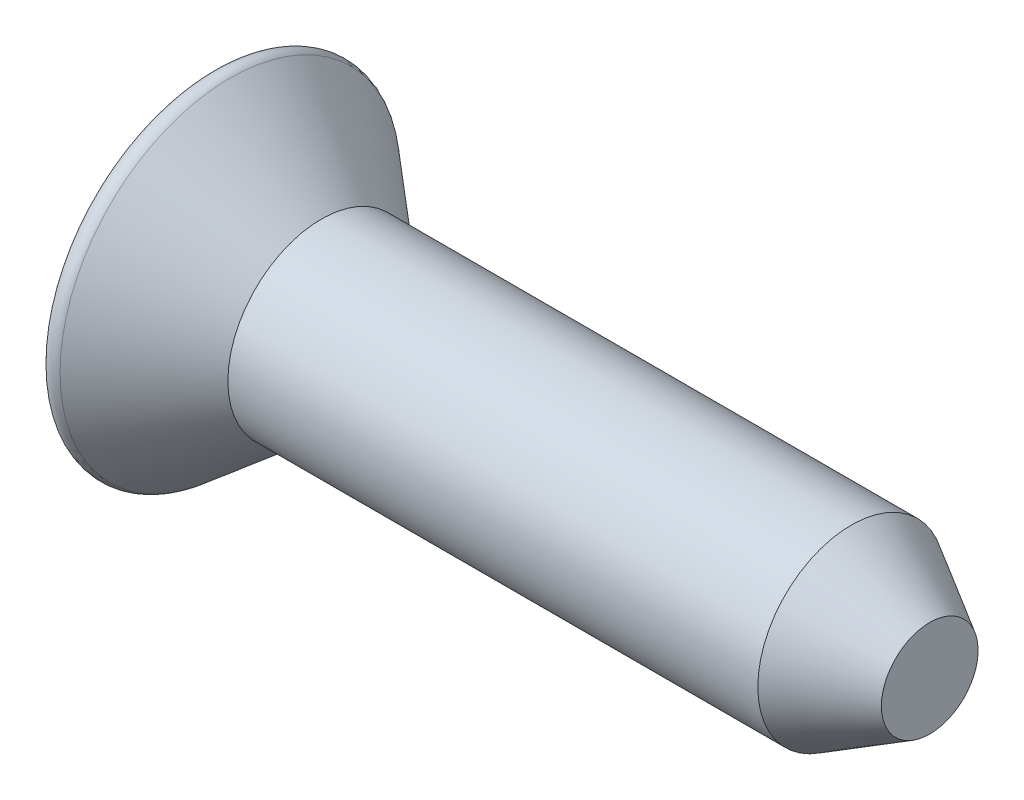
ISO-10303-21;
HEADER;
FILE_DESCRIPTION(('STEP AP214'),'2;1');
FILE_NAME('part.step','',(''),(''),'','','');
FILE_SCHEMA(('AUTOMOTIVE_DESIGN { 1 0 10303 214 1 1 1 1 }'));
ENDSEC;
DATA;
#1=APPLICATION_CONTEXT('core data for automotive mechanical design processes');
#2=APPLICATION_PROTOCOL_DEFINITION('international standard','automotive_design',2000,#1);
#3=PRODUCT_CONTEXT('',#1,'mechanical');
#4=PRODUCT('Part','Part','',(#3));
#5=PRODUCT_RELATED_PRODUCT_CATEGORY('part','',(#4));
#6=PRODUCT_DEFINITION_FORMATION('','',#4);
#7=PRODUCT_DEFINITION_CONTEXT('part definition',#1,'design');
#8=PRODUCT_DEFINITION('design','',#6,#7);
#9=PRODUCT_DEFINITION_SHAPE('','',#8);
#10=(LENGTH_UNIT() NAMED_UNIT(*) SI_UNIT(.MILLI.,.METRE.));
#11=(NAMED_UNIT(*) PLANE_ANGLE_UNIT() SI_UNIT($,.RADIAN.));
#12=(NAMED_UNIT(*) SI_UNIT($,.STERADIAN.) SOLID_ANGLE_UNIT());
#13=UNCERTAINTY_MEASURE_WITH_UNIT(LENGTH_MEASURE(1.E-05),#10,'distance_accuracy_value','');
#14=(GEOMETRIC_REPRESENTATION_CONTEXT(3) GLOBAL_UNCERTAINTY_ASSIGNED_CONTEXT((#13)) GLOBAL_UNIT_ASSIGNED_CONTEXT((#10,
#11,#12)) REPRESENTATION_CONTEXT('',''));
#15=CARTESIAN_POINT('',(0.,0.,0.));
#16=DIRECTION('',(0.,0.,1.));
#17=DIRECTION('',(1.,0.,0.));
#18=AXIS2_PLACEMENT_3D('',#15,#16,#17);
#19=CARTESIAN_POINT('',(0.,0.,0.));
#20=DIRECTION('',(-1.,0.,0.));
#21=DIRECTION('',(0.,0.,1.));
#22=AXIS2_PLACEMENT_3D('',#19,#20,#21);
#23=CYLINDRICAL_SURFACE('',#22,0.762);
#24=CARTESIAN_POINT('',(0.889,0.,0.));
#25=DIRECTION('',(-1.,0.,0.));
#26=DIRECTION('',(0.,0.,1.));
#27=AXIS2_PLACEMENT_3D('',#24,#25,#26);
#28=CIRCLE('',#27,0.762);
#29=CARTESIAN_POINT('',(0.889,0.,0.762));
#30=VERTEX_POINT('',#29);
#31=EDGE_CURVE('E226',#30,#30,#28,.T.);
#32=ORIENTED_EDGE('',*,*,#31,.F.);
#33=EDGE_LOOP('',(#32));
#34=FACE_BOUND('',#33,.T.);
#35=CARTESIAN_POINT('',(5.20408568757237,0.,0.));
#36=DIRECTION('',(-1.,0.,0.));
#37=DIRECTION('',(0.,0.,1.));
#38=AXIS2_PLACEMENT_3D('',#35,#36,#37);
#39=CIRCLE('',#38,0.762);
#40=CARTESIAN_POINT('',(5.20408568757237,0.,0.762));
#41=VERTEX_POINT('',#40);
#42=EDGE_CURVE('E445',#41,#41,#39,.T.);
#43=ORIENTED_EDGE('',*,*,#42,.T.);
#44=EDGE_LOOP('',(#43));
#45=FACE_BOUND('',#44,.T.);
#46=ADVANCED_FACE('F68',(#34,#45),#23,.T.);
#47=CARTESIAN_POINT('',(0.889,0.,0.));
#48=DIRECTION('',(-1.,0.,0.));
#49=DIRECTION('',(0.,0.,1.));
#50=AXIS2_PLACEMENT_3D('',#47,#48,#49);
#51=CONICAL_SURFACE('',#50,0.762,0.698131700797734);
#52=ORIENTED_EDGE('',*,*,#31,.T.);
#53=EDGE_LOOP('',(#52));
#54=FACE_BOUND('',#53,.T.);
#55=CARTESIAN_POINT('',(0.146043818501133,0.,0.));
#56=DIRECTION('',(-1.,0.,0.));
#57=DIRECTION('',(0.,0.,1.));
#58=AXIS2_PLACEMENT_3D('',#55,#56,#57);
#59=CIRCLE('',#58,1.38541425787658);
#60=CARTESIAN_POINT('',(0.146043818501133,0.,1.38541425787658));
#61=VERTEX_POINT('',#60);
#62=EDGE_CURVE('E229',#61,#61,#59,.T.);
#63=ORIENTED_EDGE('',*,*,#62,.F.);
#64=EDGE_LOOP('',(#63));
#65=FACE_BOUND('',#64,.T.);
#66=ADVANCED_FACE('F370',(#54,#65),#51,.T.);
#67=CARTESIAN_POINT('',(0.,0.1778,-0.7874));
#68=DIRECTION('',(-0.342020143325669,0.,0.939692620785908));
#69=DIRECTION('',(0.939692620785908,0.,0.342020143325669));
#70=AXIS2_PLACEMENT_3D('',#67,#68,#69);
#71=PLANE('',#70);
#72=DIRECTION('',(-0.939692620785908,0.,-0.342020143325669));
#73=VECTOR('',#72,1.);
#74=CARTESIAN_POINT('',(0.,-0.1778,-0.7874));
#75=LINE('',#74,#73);
#76=CARTESIAN_POINT('',(0.889,-0.1778,-0.463830461737345));
#77=VERTEX_POINT('',#76);
#78=CARTESIAN_POINT('',(0.,-0.1778,-0.7874));
#79=VERTEX_POINT('',#78);
#80=EDGE_CURVE('E236',#77,#79,#75,.T.);
#81=ORIENTED_EDGE('',*,*,#80,.F.);
#82=DIRECTION('',(0.,1.,0.));
#83=VECTOR('',#82,1.);
#84=CARTESIAN_POINT('',(0.889,0.1778,-0.463830461737345));
#85=LINE('',#84,#83);
#86=CARTESIAN_POINT('',(0.889,0.1778,-0.463830461737345));
#87=VERTEX_POINT('',#86);
#88=EDGE_CURVE('E42',#77,#87,#85,.T.);
#89=ORIENTED_EDGE('',*,*,#88,.T.);
#90=DIRECTION('',(-0.939692620785908,0.,-0.342020143325669));
#91=VECTOR('',#90,1.);
#92=CARTESIAN_POINT('',(0.785006754966385,0.1778,-0.501680907494333));
#93=LINE('',#92,#91);
#94=CARTESIAN_POINT('',(0.,0.1778,-0.7874));
#95=VERTEX_POINT('',#94);
#96=EDGE_CURVE('E240',#87,#95,#93,.T.);
#97=ORIENTED_EDGE('',*,*,#96,.T.);
#98=DIRECTION('',(0.,1.,0.));
#99=VECTOR('',#98,1.);
#100=CARTESIAN_POINT('',(0.,0.1778,-0.7874));
#101=LINE('',#100,#99);
#102=EDGE_CURVE('E219',#79,#95,#101,.T.);
#103=ORIENTED_EDGE('',*,*,#102,.F.);
#104=EDGE_LOOP('',(#81,#89,#97,#103));
#105=FACE_BOUND('',#104,.T.);
#106=ADVANCED_FACE('F348',(#105),#71,.T.);
#107=CARTESIAN_POINT('',(0.889,0.1778,-0.1778));
#108=DIRECTION('',(-1.,0.,0.));
#109=DIRECTION('',(0.,0.,1.));
#110=AXIS2_PLACEMENT_3D('',#107,#108,#109);
#111=PLANE('',#110);
#112=DIRECTION('',(0.,-0.707106781186547,-0.707106781186548));
#113=VECTOR('',#112,1.);
#114=CARTESIAN_POINT('',(0.889,-0.33528,0.1778));
#115=LINE('',#114,#113);
#116=CARTESIAN_POINT('',(0.889,-0.1778,0.33528));
#117=VERTEX_POINT('',#116);
#118=CARTESIAN_POINT('',(0.889,-0.33528,0.1778));
#119=VERTEX_POINT('',#118);
#120=EDGE_CURVE('E187',#117,#119,#115,.T.);
#121=ORIENTED_EDGE('',*,*,#120,.F.);
#122=DIRECTION('',(0.,0.,-1.));
#123=VECTOR('',#122,1.);
#124=CARTESIAN_POINT('',(0.889,-0.1778,0.1778));
#125=LINE('',#124,#123);
#126=CARTESIAN_POINT('',(0.889,-0.1778,0.463830461737345));
#127=VERTEX_POINT('',#126);
#128=EDGE_CURVE('E301',#127,#117,#125,.T.);
#129=ORIENTED_EDGE('',*,*,#128,.F.);
#130=DIRECTION('',(0.,-1.,0.));
#131=VECTOR('',#130,1.);
#132=CARTESIAN_POINT('',(0.889,0.1778,0.463830461737345));
#133=LINE('',#132,#131);
#134=CARTESIAN_POINT('',(0.889,0.1778,0.463830461737345));
#135=VERTEX_POINT('',#134);
#136=EDGE_CURVE('E255',#135,#127,#133,.T.);
#137=ORIENTED_EDGE('',*,*,#136,.F.);
#138=DIRECTION('',(0.,0.,1.));
#139=VECTOR('',#138,1.);
#140=CARTESIAN_POINT('',(0.889,0.1778,0.1778));
#141=LINE('',#140,#139);
#142=CARTESIAN_POINT('',(0.889,0.1778,0.33528));
#143=VERTEX_POINT('',#142);
#144=EDGE_CURVE('E272',#143,#135,#141,.T.);
#145=ORIENTED_EDGE('',*,*,#144,.F.);
#146=DIRECTION('',(0.,-0.707106781186548,0.707106781186548));
#147=VECTOR('',#146,1.);
#148=CARTESIAN_POINT('',(0.889,0.33528,0.1778));
#149=LINE('',#148,#147);
#150=CARTESIAN_POINT('',(0.889,0.33528,0.1778));
#151=VERTEX_POINT('',#150);
#152=EDGE_CURVE('E268',#151,#143,#149,.T.);
#153=ORIENTED_EDGE('',*,*,#152,.F.);
#154=DIRECTION('',(0.,-1.,0.));
#155=VECTOR('',#154,1.);
#156=CARTESIAN_POINT('',(0.889,0.7874,0.1778));
#157=LINE('',#156,#155);
#158=CARTESIAN_POINT('',(0.889,0.463830461737345,0.1778));
#159=VERTEX_POINT('',#158);
#160=EDGE_CURVE('E265',#159,#151,#157,.T.);
#161=ORIENTED_EDGE('',*,*,#160,.F.);
#162=DIRECTION('',(0.,0.,1.));
#163=VECTOR('',#162,1.);
#164=CARTESIAN_POINT('',(0.889,0.463830461737345,-0.1778));
#165=LINE('',#164,#163);
#166=CARTESIAN_POINT('',(0.889,0.463830461737345,-0.1778));
#167=VERTEX_POINT('',#166);
#168=EDGE_CURVE('E76',#167,#159,#165,.T.);
#169=ORIENTED_EDGE('',*,*,#168,.F.);
#170=DIRECTION('',(0.,1.,0.));
#171=VECTOR('',#170,1.);
#172=CARTESIAN_POINT('',(0.889,0.7874,-0.1778));
#173=LINE('',#172,#171);
#174=CARTESIAN_POINT('',(0.889,0.33528,-0.1778));
#175=VERTEX_POINT('',#174);
#176=EDGE_CURVE('E225',#175,#167,#173,.T.);
#177=ORIENTED_EDGE('',*,*,#176,.F.);
#178=DIRECTION('',(0.,0.707106781186548,0.707106781186548));
#179=VECTOR('',#178,1.);
#180=CARTESIAN_POINT('',(0.889,0.33528,-0.1778));
#181=LINE('',#180,#179);
#182=CARTESIAN_POINT('',(0.889,0.1778,-0.33528));
#183=VERTEX_POINT('',#182);
#184=EDGE_CURVE('E83',#183,#175,#181,.T.);
#185=ORIENTED_EDGE('',*,*,#184,.F.);
#186=DIRECTION('',(0.,0.,1.));
#187=VECTOR('',#186,1.);
#188=CARTESIAN_POINT('',(0.889,0.1778,-0.7874));
#189=LINE('',#188,#187);
#190=EDGE_CURVE('E242',#87,#183,#189,.T.);
#191=ORIENTED_EDGE('',*,*,#190,.F.);
#192=ORIENTED_EDGE('',*,*,#88,.F.);
#193=DIRECTION('',(0.,0.,-1.));
#194=VECTOR('',#193,1.);
#195=CARTESIAN_POINT('',(0.889,-0.1778,-0.7874));
#196=LINE('',#195,#194);
#197=CARTESIAN_POINT('',(0.889,-0.1778,-0.33528));
#198=VERTEX_POINT('',#197);
#199=EDGE_CURVE('E337',#198,#77,#196,.T.);
#200=ORIENTED_EDGE('',*,*,#199,.F.);
#201=DIRECTION('',(0.,0.707106781186547,-0.707106781186548));
#202=VECTOR('',#201,1.);
#203=CARTESIAN_POINT('',(0.889,-0.33528,-0.1778));
#204=LINE('',#203,#202);
#205=CARTESIAN_POINT('',(0.889,-0.33528,-0.1778));
#206=VERTEX_POINT('',#205);
#207=EDGE_CURVE('E307',#206,#198,#204,.T.);
#208=ORIENTED_EDGE('',*,*,#207,.F.);
#209=DIRECTION('',(0.,1.,0.));
#210=VECTOR('',#209,1.);
#211=CARTESIAN_POINT('',(0.889,-0.1778,-0.1778));
#212=LINE('',#211,#210);
#213=CARTESIAN_POINT('',(0.889,-0.463830461737345,-0.1778));
#214=VERTEX_POINT('',#213);
#215=EDGE_CURVE('E334',#214,#206,#212,.T.);
#216=ORIENTED_EDGE('',*,*,#215,.F.);
#217=DIRECTION('',(0.,0.,-1.));
#218=VECTOR('',#217,1.);
#219=CARTESIAN_POINT('',(0.889,-0.463830461737345,-0.1778));
#220=LINE('',#219,#218);
#221=CARTESIAN_POINT('',(0.889,-0.463830461737345,0.1778));
#222=VERTEX_POINT('',#221);
#223=EDGE_CURVE('E91',#222,#214,#220,.T.);
#224=ORIENTED_EDGE('',*,*,#223,.F.);
#225=DIRECTION('',(0.,-1.,0.));
#226=VECTOR('',#225,1.);
#227=CARTESIAN_POINT('',(0.889,-0.1778,0.1778));
#228=LINE('',#227,#226);
#229=EDGE_CURVE('E332',#119,#222,#228,.T.);
#230=ORIENTED_EDGE('',*,*,#229,.F.);
#231=EDGE_LOOP('',(#121,#129,#137,#145,#153,#161,#169,#177,#185,#191,#192,#200,#208,#216,#224,#230));
#232=FACE_BOUND('',#231,.T.);
#233=ADVANCED_FACE('F266',(#232),#111,.T.);
#234=CARTESIAN_POINT('',(0.,0.7874,-0.1778));
#235=DIRECTION('',(-0.342020143325669,-0.939692620785908,0.));
#236=DIRECTION('',(0.939692620785908,-0.342020143325669,0.));
#237=AXIS2_PLACEMENT_3D('',#234,#235,#236);
#238=PLANE('',#237);
#239=DIRECTION('',(-0.939692620785908,0.342020143325669,0.));
#240=VECTOR('',#239,1.);
#241=CARTESIAN_POINT('',(0.,0.7874,-0.1778));
#242=LINE('',#241,#240);
#243=CARTESIAN_POINT('',(0.,0.7874,-0.1778));
#244=VERTEX_POINT('',#243);
#245=EDGE_CURVE('E230',#167,#244,#242,.T.);
#246=ORIENTED_EDGE('',*,*,#245,.F.);
#247=ORIENTED_EDGE('',*,*,#168,.T.);
#248=DIRECTION('',(-0.939692620785908,0.342020143325669,0.));
#249=VECTOR('',#248,1.);
#250=CARTESIAN_POINT('',(0.785006754966385,0.501680907494333,0.1778));
#251=LINE('',#250,#249);
#252=CARTESIAN_POINT('',(0.,0.7874,0.1778));
#253=VERTEX_POINT('',#252);
#254=EDGE_CURVE('E245',#159,#253,#251,.T.);
#255=ORIENTED_EDGE('',*,*,#254,.T.);
#256=DIRECTION('',(0.,0.,1.));
#257=VECTOR('',#256,1.);
#258=CARTESIAN_POINT('',(0.,0.7874,-0.1778));
#259=LINE('',#258,#257);
#260=EDGE_CURVE('E281',#244,#253,#259,.T.);
#261=ORIENTED_EDGE('',*,*,#260,.F.);
#262=EDGE_LOOP('',(#246,#247,#255,#261));
#263=FACE_BOUND('',#262,.T.);
#264=ADVANCED_FACE('F260',(#263),#238,.T.);
#265=CARTESIAN_POINT('',(0.,0.1778,0.7874));
#266=DIRECTION('',(-0.342020143325669,0.,-0.939692620785908));
#267=DIRECTION('',(-0.939692620785908,0.,0.342020143325669));
#268=AXIS2_PLACEMENT_3D('',#265,#266,#267);
#269=PLANE('',#268);
#270=DIRECTION('',(-0.939692620785908,0.,0.342020143325669));
#271=VECTOR('',#270,1.);
#272=CARTESIAN_POINT('',(0.,0.1778,0.7874));
#273=LINE('',#272,#271);
#274=CARTESIAN_POINT('',(0.,0.1778,0.7874));
#275=VERTEX_POINT('',#274);
#276=EDGE_CURVE('E247',#135,#275,#273,.T.);
#277=ORIENTED_EDGE('',*,*,#276,.F.);
#278=ORIENTED_EDGE('',*,*,#136,.T.);
#279=DIRECTION('',(-0.939692620785908,0.,0.342020143325669));
#280=VECTOR('',#279,1.);
#281=CARTESIAN_POINT('',(0.980928418398843,-0.1778,0.430371253756997));
#282=LINE('',#281,#280);
#283=CARTESIAN_POINT('',(0.,-0.1778,0.7874));
#284=VERTEX_POINT('',#283);
#285=EDGE_CURVE('E250',#127,#284,#282,.T.);
#286=ORIENTED_EDGE('',*,*,#285,.T.);
#287=DIRECTION('',(0.,-1.,0.));
#288=VECTOR('',#287,1.);
#289=CARTESIAN_POINT('',(0.,0.1778,0.7874));
#290=LINE('',#289,#288);
#291=EDGE_CURVE('E211',#275,#284,#290,.T.);
#292=ORIENTED_EDGE('',*,*,#291,.F.);
#293=EDGE_LOOP('',(#277,#278,#286,#292));
#294=FACE_BOUND('',#293,.T.);
#295=ADVANCED_FACE('F294',(#294),#269,.T.);
#296=CARTESIAN_POINT('',(0.,-0.7874,-0.1778));
#297=DIRECTION('',(-0.342020143325669,0.939692620785908,0.));
#298=DIRECTION('',(-0.939692620785908,-0.342020143325669,0.));
#299=AXIS2_PLACEMENT_3D('',#296,#297,#298);
#300=PLANE('',#299);
#301=DIRECTION('',(-0.939692620785908,-0.342020143325669,0.));
#302=VECTOR('',#301,1.);
#303=CARTESIAN_POINT('',(0.,-0.7874,0.1778));
#304=LINE('',#303,#302);
#305=CARTESIAN_POINT('',(0.,-0.7874,0.1778));
#306=VERTEX_POINT('',#305);
#307=EDGE_CURVE('E205',#222,#306,#304,.T.);
#308=ORIENTED_EDGE('',*,*,#307,.F.);
#309=ORIENTED_EDGE('',*,*,#223,.T.);
#310=DIRECTION('',(-0.939692620785908,-0.342020143325669,0.));
#311=VECTOR('',#310,1.);
#312=CARTESIAN_POINT('',(0.980928418398843,-0.430371253756997,-0.1778));
#313=LINE('',#312,#311);
#314=CARTESIAN_POINT('',(0.,-0.7874,-0.1778));
#315=VERTEX_POINT('',#314);
#316=EDGE_CURVE('E239',#214,#315,#313,.T.);
#317=ORIENTED_EDGE('',*,*,#316,.T.);
#318=DIRECTION('',(0.,0.,-1.));
#319=VECTOR('',#318,1.);
#320=CARTESIAN_POINT('',(0.,-0.7874,-0.1778));
#321=LINE('',#320,#319);
#322=EDGE_CURVE('E207',#306,#315,#321,.T.);
#323=ORIENTED_EDGE('',*,*,#322,.F.);
#324=EDGE_LOOP('',(#308,#309,#317,#323));
#325=FACE_BOUND('',#324,.T.);
#326=ADVANCED_FACE('F70',(#325),#300,.T.);
#327=CARTESIAN_POINT('',(0.,0.,0.));
#328=DIRECTION('',(1.,0.,0.));
#329=DIRECTION('',(0.,0.,-1.));
#330=AXIS2_PLACEMENT_3D('',#327,#328,#329);
#331=PLANE('',#330);
#332=CARTESIAN_POINT('',(0.,0.,0.));
#333=DIRECTION('',(-1.,0.,0.));
#334=DIRECTION('',(0.,0.,1.));
#335=AXIS2_PLACEMENT_3D('',#332,#333,#334);
#336=CIRCLE('',#335,1.3173129068833);
#337=CARTESIAN_POINT('',(0.,0.,1.3173129068833));
#338=VERTEX_POINT('',#337);
#339=EDGE_CURVE('E233',#338,#338,#336,.T.);
#340=ORIENTED_EDGE('',*,*,#339,.T.);
#341=EDGE_LOOP('',(#340));
#342=FACE_BOUND('',#341,.T.);
#343=DIRECTION('',(0.,0.,-1.));
#344=VECTOR('',#343,1.);
#345=CARTESIAN_POINT('',(0.,-0.1778,0.1778));
#346=LINE('',#345,#344);
#347=CARTESIAN_POINT('',(0.,-0.1778,0.33528));
#348=VERTEX_POINT('',#347);
#349=EDGE_CURVE('E201',#284,#348,#346,.T.);
#350=ORIENTED_EDGE('',*,*,#349,.T.);
#351=DIRECTION('',(0.,0.707106781186547,0.707106781186548));
#352=VECTOR('',#351,1.);
#353=CARTESIAN_POINT('',(0.,-0.33528,0.1778));
#354=LINE('',#353,#352);
#355=CARTESIAN_POINT('',(0.,-0.33528,0.1778));
#356=VERTEX_POINT('',#355);
#357=EDGE_CURVE('E184',#356,#348,#354,.T.);
#358=ORIENTED_EDGE('',*,*,#357,.F.);
#359=DIRECTION('',(0.,-1.,0.));
#360=VECTOR('',#359,1.);
#361=CARTESIAN_POINT('',(0.,-0.1778,0.1778));
#362=LINE('',#361,#360);
#363=EDGE_CURVE('E197',#356,#306,#362,.T.);
#364=ORIENTED_EDGE('',*,*,#363,.T.);
#365=ORIENTED_EDGE('',*,*,#322,.T.);
#366=DIRECTION('',(0.,1.,0.));
#367=VECTOR('',#366,1.);
#368=CARTESIAN_POINT('',(0.,-0.1778,-0.1778));
#369=LINE('',#368,#367);
#370=CARTESIAN_POINT('',(0.,-0.33528,-0.1778));
#371=VERTEX_POINT('',#370);
#372=EDGE_CURVE('E209',#315,#371,#369,.T.);
#373=ORIENTED_EDGE('',*,*,#372,.T.);
#374=DIRECTION('',(0.,-0.707106781186547,0.707106781186548));
#375=VECTOR('',#374,1.);
#376=CARTESIAN_POINT('',(0.,-0.33528,-0.1778));
#377=LINE('',#376,#375);
#378=CARTESIAN_POINT('',(0.,-0.1778,-0.33528));
#379=VERTEX_POINT('',#378);
#380=EDGE_CURVE('E303',#379,#371,#377,.T.);
#381=ORIENTED_EDGE('',*,*,#380,.F.);
#382=DIRECTION('',(0.,0.,-1.));
#383=VECTOR('',#382,1.);
#384=CARTESIAN_POINT('',(0.,-0.1778,-0.7874));
#385=LINE('',#384,#383);
#386=EDGE_CURVE('E217',#379,#79,#385,.T.);
#387=ORIENTED_EDGE('',*,*,#386,.T.);
#388=ORIENTED_EDGE('',*,*,#102,.T.);
#389=DIRECTION('',(0.,0.,1.));
#390=VECTOR('',#389,1.);
#391=CARTESIAN_POINT('',(0.,0.1778,-0.7874));
#392=LINE('',#391,#390);
#393=CARTESIAN_POINT('',(0.,0.1778,-0.33528));
#394=VERTEX_POINT('',#393);
#395=EDGE_CURVE('E222',#95,#394,#392,.T.);
#396=ORIENTED_EDGE('',*,*,#395,.T.);
#397=DIRECTION('',(0.,-0.707106781186547,-0.707106781186547));
#398=VECTOR('',#397,1.);
#399=CARTESIAN_POINT('',(0.,0.33528,-0.1778));
#400=LINE('',#399,#398);
#401=CARTESIAN_POINT('',(0.,0.33528,-0.1778));
#402=VERTEX_POINT('',#401);
#403=EDGE_CURVE('E309',#402,#394,#400,.T.);
#404=ORIENTED_EDGE('',*,*,#403,.F.);
#405=DIRECTION('',(0.,1.,0.));
#406=VECTOR('',#405,1.);
#407=CARTESIAN_POINT('',(0.,0.7874,-0.1778));
#408=LINE('',#407,#406);
#409=EDGE_CURVE('E285',#402,#244,#408,.T.);
#410=ORIENTED_EDGE('',*,*,#409,.T.);
#411=ORIENTED_EDGE('',*,*,#260,.T.);
#412=DIRECTION('',(0.,-1.,0.));
#413=VECTOR('',#412,1.);
#414=CARTESIAN_POINT('',(0.,0.7874,0.1778));
#415=LINE('',#414,#413);
#416=CARTESIAN_POINT('',(0.,0.33528,0.1778));
#417=VERTEX_POINT('',#416);
#418=EDGE_CURVE('E276',#253,#417,#415,.T.);
#419=ORIENTED_EDGE('',*,*,#418,.T.);
#420=DIRECTION('',(0.,0.707106781186547,-0.707106781186547));
#421=VECTOR('',#420,1.);
#422=CARTESIAN_POINT('',(0.,0.33528,0.1778));
#423=LINE('',#422,#421);
#424=CARTESIAN_POINT('',(0.,0.1778,0.33528));
#425=VERTEX_POINT('',#424);
#426=EDGE_CURVE('E323',#425,#417,#423,.T.);
#427=ORIENTED_EDGE('',*,*,#426,.F.);
#428=DIRECTION('',(0.,0.,1.));
#429=VECTOR('',#428,1.);
#430=CARTESIAN_POINT('',(0.,0.1778,0.1778));
#431=LINE('',#430,#429);
#432=EDGE_CURVE('E280',#425,#275,#431,.T.);
#433=ORIENTED_EDGE('',*,*,#432,.T.);
#434=ORIENTED_EDGE('',*,*,#291,.T.);
#435=EDGE_LOOP('',(#350,#358,#364,#365,#373,#381,#387,#388,#396,#404,#410,#411,#419,#427,#433,#434));
#436=FACE_BOUND('',#435,.T.);
#437=ADVANCED_FACE('F195',(#342,#436),#331,.F.);
#438=CARTESIAN_POINT('',(0.0889,0.,0.));
#439=DIRECTION('',(-1.,0.,0.));
#440=DIRECTION('',(0.,0.,1.));
#441=AXIS2_PLACEMENT_3D('',#438,#439,#440);
#442=TOROIDAL_SURFACE('',#441,1.3173129068833,0.0889000000000001);
#443=ORIENTED_EDGE('',*,*,#339,.F.);
#444=EDGE_LOOP('',(#443));
#445=FACE_BOUND('',#444,.T.);
#446=ORIENTED_EDGE('',*,*,#62,.T.);
#447=EDGE_LOOP('',(#446));
#448=FACE_BOUND('',#447,.T.);
#449=ADVANCED_FACE('F366',(#445,#448),#442,.T.);
#450=CARTESIAN_POINT('',(0.889,0.7874,-0.1778));
#451=DIRECTION('',(0.,0.,1.));
#452=DIRECTION('',(0.,-1.,0.));
#453=AXIS2_PLACEMENT_3D('',#450,#451,#452);
#454=PLANE('',#453);
#455=DIRECTION('',(-1.,0.,0.));
#456=VECTOR('',#455,1.);
#457=CARTESIAN_POINT('',(1.11171035180252,0.33528,-0.1778));
#458=LINE('',#457,#456);
#459=EDGE_CURVE('E317',#175,#402,#458,.T.);
#460=ORIENTED_EDGE('',*,*,#459,.F.);
#461=ORIENTED_EDGE('',*,*,#176,.T.);
#462=ORIENTED_EDGE('',*,*,#245,.T.);
#463=ORIENTED_EDGE('',*,*,#409,.F.);
#464=EDGE_LOOP('',(#460,#461,#462,#463));
#465=FACE_BOUND('',#464,.T.);
#466=ADVANCED_FACE('F385',(#465),#454,.T.);
#467=CARTESIAN_POINT('',(0.889,0.7874,0.1778));
#468=DIRECTION('',(0.,0.,-1.));
#469=DIRECTION('',(-1.,0.,0.));
#470=AXIS2_PLACEMENT_3D('',#467,#468,#469);
#471=PLANE('',#470);
#472=DIRECTION('',(-1.,0.,0.));
#473=VECTOR('',#472,1.);
#474=CARTESIAN_POINT('',(1.11171035180252,0.33528,0.1778));
#475=LINE('',#474,#473);
#476=EDGE_CURVE('E278',#151,#417,#475,.T.);
#477=ORIENTED_EDGE('',*,*,#476,.T.);
#478=ORIENTED_EDGE('',*,*,#418,.F.);
#479=ORIENTED_EDGE('',*,*,#254,.F.);
#480=ORIENTED_EDGE('',*,*,#160,.T.);
#481=EDGE_LOOP('',(#477,#478,#479,#480));
#482=FACE_BOUND('',#481,.T.);
#483=ADVANCED_FACE('F274',(#482),#471,.T.);
#484=CARTESIAN_POINT('',(0.889,0.1778,0.1778));
#485=DIRECTION('',(0.,-1.,0.));
#486=DIRECTION('',(0.,0.,-1.));
#487=AXIS2_PLACEMENT_3D('',#484,#485,#486);
#488=PLANE('',#487);
#489=DIRECTION('',(-1.,0.,0.));
#490=VECTOR('',#489,1.);
#491=CARTESIAN_POINT('',(1.11171035180252,0.1778,0.33528));
#492=LINE('',#491,#490);
#493=EDGE_CURVE('E326',#143,#425,#492,.T.);
#494=ORIENTED_EDGE('',*,*,#493,.F.);
#495=ORIENTED_EDGE('',*,*,#144,.T.);
#496=ORIENTED_EDGE('',*,*,#276,.T.);
#497=ORIENTED_EDGE('',*,*,#432,.F.);
#498=EDGE_LOOP('',(#494,#495,#496,#497));
#499=FACE_BOUND('',#498,.T.);
#500=ADVANCED_FACE('F411',(#499),#488,.T.);
#501=CARTESIAN_POINT('',(0.889,-0.1778,0.1778));
#502=DIRECTION('',(0.,1.,0.));
#503=DIRECTION('',(0.,0.,1.));
#504=AXIS2_PLACEMENT_3D('',#501,#502,#503);
#505=PLANE('',#504);
#506=DIRECTION('',(-1.,0.,0.));
#507=VECTOR('',#506,1.);
#508=CARTESIAN_POINT('',(1.11171035180252,-0.1778,0.33528));
#509=LINE('',#508,#507);
#510=EDGE_CURVE('E191',#117,#348,#509,.T.);
#511=ORIENTED_EDGE('',*,*,#510,.T.);
#512=ORIENTED_EDGE('',*,*,#349,.F.);
#513=ORIENTED_EDGE('',*,*,#285,.F.);
#514=ORIENTED_EDGE('',*,*,#128,.T.);
#515=EDGE_LOOP('',(#511,#512,#513,#514));
#516=FACE_BOUND('',#515,.T.);
#517=ADVANCED_FACE('F300',(#516),#505,.T.);
#518=CARTESIAN_POINT('',(0.889,-0.1778,0.1778));
#519=DIRECTION('',(0.,0.,-1.));
#520=DIRECTION('',(0.,1.,0.));
#521=AXIS2_PLACEMENT_3D('',#518,#519,#520);
#522=PLANE('',#521);
#523=DIRECTION('',(-1.,0.,0.));
#524=VECTOR('',#523,1.);
#525=CARTESIAN_POINT('',(1.11171035180252,-0.33528,0.1778));
#526=LINE('',#525,#524);
#527=EDGE_CURVE('E181',#119,#356,#526,.T.);
#528=ORIENTED_EDGE('',*,*,#527,.F.);
#529=ORIENTED_EDGE('',*,*,#229,.T.);
#530=ORIENTED_EDGE('',*,*,#307,.T.);
#531=ORIENTED_EDGE('',*,*,#363,.F.);
#532=EDGE_LOOP('',(#528,#529,#530,#531));
#533=FACE_BOUND('',#532,.T.);
#534=ADVANCED_FACE('F204',(#533),#522,.T.);
#535=CARTESIAN_POINT('',(0.889,-0.1778,-0.1778));
#536=DIRECTION('',(0.,0.,1.));
#537=DIRECTION('',(0.,-1.,0.));
#538=AXIS2_PLACEMENT_3D('',#535,#536,#537);
#539=PLANE('',#538);
#540=DIRECTION('',(-1.,0.,0.));
#541=VECTOR('',#540,1.);
#542=CARTESIAN_POINT('',(1.11171035180252,-0.33528,-0.1778));
#543=LINE('',#542,#541);
#544=EDGE_CURVE('E310',#206,#371,#543,.T.);
#545=ORIENTED_EDGE('',*,*,#544,.T.);
#546=ORIENTED_EDGE('',*,*,#372,.F.);
#547=ORIENTED_EDGE('',*,*,#316,.F.);
#548=ORIENTED_EDGE('',*,*,#215,.T.);
#549=EDGE_LOOP('',(#545,#546,#547,#548));
#550=FACE_BOUND('',#549,.T.);
#551=ADVANCED_FACE('F360',(#550),#539,.T.);
#552=CARTESIAN_POINT('',(0.889,-0.1778,-0.7874));
#553=DIRECTION('',(0.,1.,0.));
#554=DIRECTION('',(0.,0.,1.));
#555=AXIS2_PLACEMENT_3D('',#552,#553,#554);
#556=PLANE('',#555);
#557=DIRECTION('',(-1.,0.,0.));
#558=VECTOR('',#557,1.);
#559=CARTESIAN_POINT('',(1.11171035180252,-0.1778,-0.33528));
#560=LINE('',#559,#558);
#561=EDGE_CURVE('E312',#198,#379,#560,.T.);
#562=ORIENTED_EDGE('',*,*,#561,.F.);
#563=ORIENTED_EDGE('',*,*,#199,.T.);
#564=ORIENTED_EDGE('',*,*,#80,.T.);
#565=ORIENTED_EDGE('',*,*,#386,.F.);
#566=EDGE_LOOP('',(#562,#563,#564,#565));
#567=FACE_BOUND('',#566,.T.);
#568=ADVANCED_FACE('F352',(#567),#556,.T.);
#569=CARTESIAN_POINT('',(0.889,0.1778,-0.7874));
#570=DIRECTION('',(0.,-1.,0.));
#571=DIRECTION('',(0.,0.,-1.));
#572=AXIS2_PLACEMENT_3D('',#569,#570,#571);
#573=PLANE('',#572);
#574=DIRECTION('',(-1.,0.,0.));
#575=VECTOR('',#574,1.);
#576=CARTESIAN_POINT('',(1.11171035180252,0.1778,-0.33528));
#577=LINE('',#576,#575);
#578=EDGE_CURVE('E318',#183,#394,#577,.T.);
#579=ORIENTED_EDGE('',*,*,#578,.T.);
#580=ORIENTED_EDGE('',*,*,#395,.F.);
#581=ORIENTED_EDGE('',*,*,#96,.F.);
#582=ORIENTED_EDGE('',*,*,#190,.T.);
#583=EDGE_LOOP('',(#579,#580,#581,#582));
#584=FACE_BOUND('',#583,.T.);
#585=ADVANCED_FACE('F341',(#584),#573,.T.);
#586=CARTESIAN_POINT('',(1.11171035180252,0.33528,0.1778));
#587=DIRECTION('',(0.,0.707106781186548,0.707106781186548));
#588=DIRECTION('',(0.,-0.707106781186548,0.707106781186548));
#589=AXIS2_PLACEMENT_3D('',#586,#587,#588);
#590=PLANE('',#589);
#591=ORIENTED_EDGE('',*,*,#152,.T.);
#592=ORIENTED_EDGE('',*,*,#493,.T.);
#593=ORIENTED_EDGE('',*,*,#426,.T.);
#594=ORIENTED_EDGE('',*,*,#476,.F.);
#595=EDGE_LOOP('',(#591,#592,#593,#594));
#596=FACE_BOUND('',#595,.T.);
#597=ADVANCED_FACE('F399',(#596),#590,.F.);
#598=CARTESIAN_POINT('',(1.11171035180252,0.33528,-0.1778));
#599=DIRECTION('',(0.,0.707106781186548,-0.707106781186548));
#600=DIRECTION('',(0.,0.707106781186548,0.707106781186548));
#601=AXIS2_PLACEMENT_3D('',#598,#599,#600);
#602=PLANE('',#601);
#603=ORIENTED_EDGE('',*,*,#184,.T.);
#604=ORIENTED_EDGE('',*,*,#459,.T.);
#605=ORIENTED_EDGE('',*,*,#403,.T.);
#606=ORIENTED_EDGE('',*,*,#578,.F.);
#607=EDGE_LOOP('',(#603,#604,#605,#606));
#608=FACE_BOUND('',#607,.T.);
#609=ADVANCED_FACE('F422',(#608),#602,.F.);
#610=CARTESIAN_POINT('',(1.11171035180252,-0.33528,-0.1778));
#611=DIRECTION('',(0.,-0.707106781186548,-0.707106781186547));
#612=DIRECTION('',(0.,0.707106781186547,-0.707106781186548));
#613=AXIS2_PLACEMENT_3D('',#610,#611,#612);
#614=PLANE('',#613);
#615=ORIENTED_EDGE('',*,*,#207,.T.);
#616=ORIENTED_EDGE('',*,*,#561,.T.);
#617=ORIENTED_EDGE('',*,*,#380,.T.);
#618=ORIENTED_EDGE('',*,*,#544,.F.);
#619=EDGE_LOOP('',(#615,#616,#617,#618));
#620=FACE_BOUND('',#619,.T.);
#621=ADVANCED_FACE('F355',(#620),#614,.F.);
#622=CARTESIAN_POINT('',(1.11171035180252,-0.33528,0.1778));
#623=DIRECTION('',(0.,-0.707106781186548,0.707106781186547));
#624=DIRECTION('',(0.,-0.707106781186547,-0.707106781186548));
#625=AXIS2_PLACEMENT_3D('',#622,#623,#624);
#626=PLANE('',#625);
#627=ORIENTED_EDGE('',*,*,#120,.T.);
#628=ORIENTED_EDGE('',*,*,#527,.T.);
#629=ORIENTED_EDGE('',*,*,#357,.T.);
#630=ORIENTED_EDGE('',*,*,#510,.F.);
#631=EDGE_LOOP('',(#627,#628,#629,#630));
#632=FACE_BOUND('',#631,.T.);
#633=ADVANCED_FACE('F183',(#632),#626,.F.);
#634=CARTESIAN_POINT('',(5.20408568757237,0.,0.));
#635=DIRECTION('',(-1.,0.,0.));
#636=DIRECTION('',(0.,0.,1.));
#637=AXIS2_PLACEMENT_3D('',#634,#635,#636);
#638=CONICAL_SURFACE('',#637,0.762,0.523598775598292);
#639=CARTESIAN_POINT('',(5.842,0.,0.));
#640=DIRECTION('',(-1.,0.,0.));
#641=DIRECTION('',(0.,0.,1.));
#642=AXIS2_PLACEMENT_3D('',#639,#640,#641);
#643=CIRCLE('',#642,0.3937);
#644=CARTESIAN_POINT('',(5.842,0.,0.3937));
#645=VERTEX_POINT('',#644);
#646=EDGE_CURVE('E202',#645,#645,#643,.T.);
#647=ORIENTED_EDGE('',*,*,#646,.T.);
#648=EDGE_LOOP('',(#647));
#649=FACE_BOUND('',#648,.T.);
#650=ORIENTED_EDGE('',*,*,#42,.F.);
#651=EDGE_LOOP('',(#650));
#652=FACE_BOUND('',#651,.T.);
#653=ADVANCED_FACE('F433',(#649,#652),#638,.T.);
#654=CARTESIAN_POINT('',(5.842,0.762,0.));
#655=DIRECTION('',(-1.,0.,0.));
#656=DIRECTION('',(0.,0.,1.));
#657=AXIS2_PLACEMENT_3D('',#654,#655,#656);
#658=PLANE('',#657);
#659=ORIENTED_EDGE('',*,*,#646,.F.);
#660=EDGE_LOOP('',(#659));
#661=FACE_BOUND('',#660,.T.);
#662=ADVANCED_FACE('F381',(#661),#658,.F.);
#663=CLOSED_SHELL('',(#46,#66,#106,#233,#264,#295,#326,#437,#449,#466,#483,#500,#517,#534,#551,
#568,#585,#597,#609,#621,#633,#653,#662));
#664=MANIFOLD_SOLID_BREP('B6',#663);
#665=ADVANCED_BREP_SHAPE_REPRESENTATION('',(#18,#664),#14);
#666=SHAPE_DEFINITION_REPRESENTATION(#9,#665);
ENDSEC;
END-ISO-10303-21;
